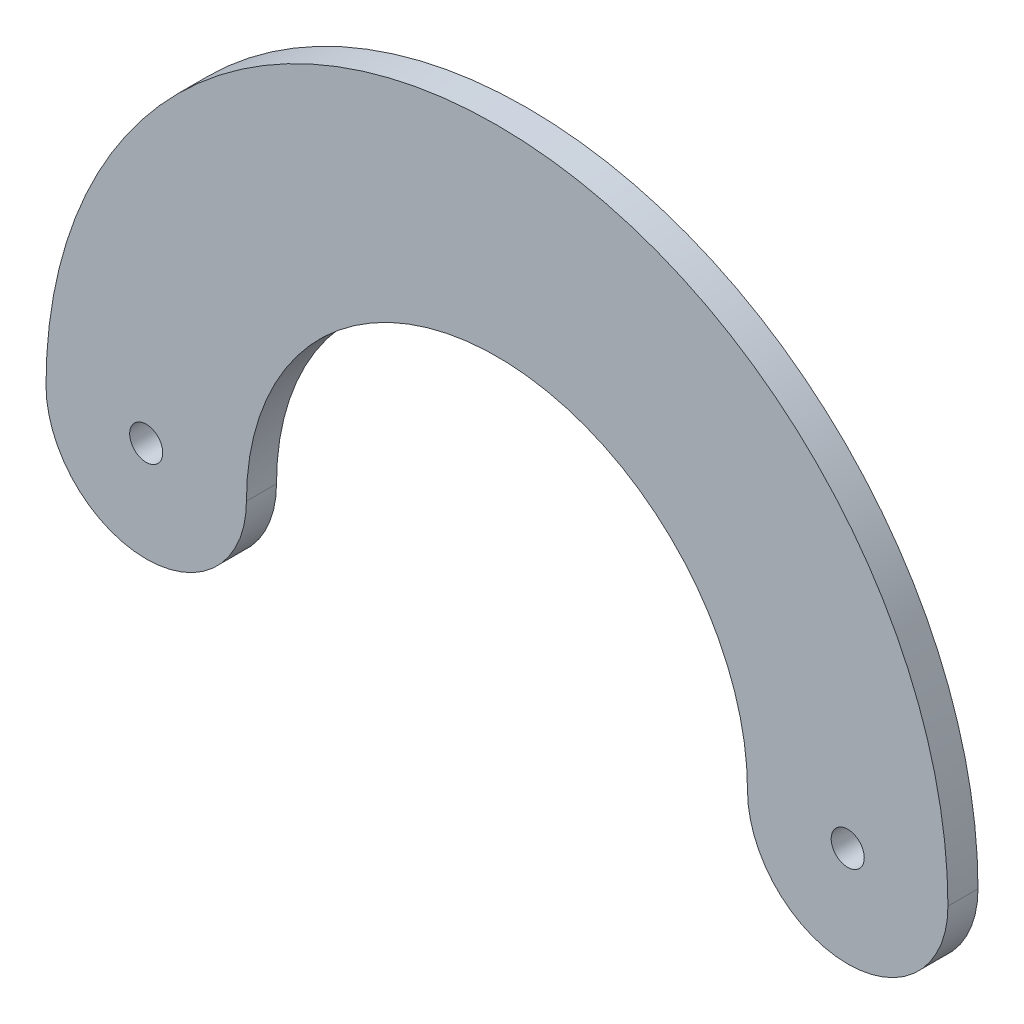
ISO-10303-21;
HEADER;
FILE_DESCRIPTION(('STEP AP214'),'2;1');
FILE_NAME('part.step','',(''),(''),'','','');
FILE_SCHEMA(('AUTOMOTIVE_DESIGN { 1 0 10303 214 1 1 1 1 }'));
ENDSEC;
DATA;
#1=APPLICATION_CONTEXT('core data for automotive mechanical design processes');
#2=APPLICATION_PROTOCOL_DEFINITION('international standard','automotive_design',2000,#1);
#3=PRODUCT_CONTEXT('',#1,'mechanical');
#4=PRODUCT('Part','Part','',(#3));
#5=PRODUCT_RELATED_PRODUCT_CATEGORY('part','',(#4));
#6=PRODUCT_DEFINITION_FORMATION('','',#4);
#7=PRODUCT_DEFINITION_CONTEXT('part definition',#1,'design');
#8=PRODUCT_DEFINITION('design','',#6,#7);
#9=PRODUCT_DEFINITION_SHAPE('','',#8);
#10=(LENGTH_UNIT() NAMED_UNIT(*) SI_UNIT(.MILLI.,.METRE.));
#11=(NAMED_UNIT(*) PLANE_ANGLE_UNIT() SI_UNIT($,.RADIAN.));
#12=(NAMED_UNIT(*) SI_UNIT($,.STERADIAN.) SOLID_ANGLE_UNIT());
#13=UNCERTAINTY_MEASURE_WITH_UNIT(LENGTH_MEASURE(1.E-05),#10,'distance_accuracy_value','');
#14=(GEOMETRIC_REPRESENTATION_CONTEXT(3) GLOBAL_UNCERTAINTY_ASSIGNED_CONTEXT((#13)) GLOBAL_UNIT_ASSIGNED_CONTEXT((#10,
#11,#12)) REPRESENTATION_CONTEXT('',''));
#15=CARTESIAN_POINT('',(0.,0.,0.));
#16=DIRECTION('',(0.,0.,1.));
#17=DIRECTION('',(1.,0.,0.));
#18=AXIS2_PLACEMENT_3D('',#15,#16,#17);
#19=CARTESIAN_POINT('',(0.,0.,3.));
#20=DIRECTION('',(0.,0.,-1.));
#21=DIRECTION('',(-1.,0.,0.));
#22=AXIS2_PLACEMENT_3D('',#19,#20,#21);
#23=CYLINDRICAL_SURFACE('',#22,25.);
#24=CARTESIAN_POINT('',(0.,0.,0.));
#25=DIRECTION('',(0.,0.,1.));
#26=DIRECTION('',(1.,0.,0.));
#27=AXIS2_PLACEMENT_3D('',#24,#25,#26);
#28=CIRCLE('',#27,25.);
#29=CARTESIAN_POINT('',(-25.,0.,0.));
#30=VERTEX_POINT('',#29);
#31=CARTESIAN_POINT('',(25.,0.,0.));
#32=VERTEX_POINT('',#31);
#33=EDGE_CURVE('E104',#30,#32,#28,.F.);
#34=ORIENTED_EDGE('',*,*,#33,.T.);
#35=DIRECTION('',(0.,0.,-1.));
#36=VECTOR('',#35,1.);
#37=CARTESIAN_POINT('',(25.,0.,3.));
#38=LINE('',#37,#36);
#39=CARTESIAN_POINT('',(25.,0.,3.));
#40=VERTEX_POINT('',#39);
#41=EDGE_CURVE('E11',#40,#32,#38,.T.);
#42=ORIENTED_EDGE('',*,*,#41,.F.);
#43=CARTESIAN_POINT('',(0.,0.,3.));
#44=DIRECTION('',(0.,0.,1.));
#45=DIRECTION('',(1.,0.,0.));
#46=AXIS2_PLACEMENT_3D('',#43,#44,#45);
#47=CIRCLE('',#46,25.);
#48=CARTESIAN_POINT('',(-25.,0.,3.));
#49=VERTEX_POINT('',#48);
#50=EDGE_CURVE('E84',#49,#40,#47,.F.);
#51=ORIENTED_EDGE('',*,*,#50,.F.);
#52=DIRECTION('',(0.,0.,-1.));
#53=VECTOR('',#52,1.);
#54=CARTESIAN_POINT('',(-25.,0.,3.));
#55=LINE('',#54,#53);
#56=EDGE_CURVE('E51',#49,#30,#55,.T.);
#57=ORIENTED_EDGE('',*,*,#56,.T.);
#58=EDGE_LOOP('',(#34,#42,#51,#57));
#59=FACE_BOUND('',#58,.T.);
#60=ADVANCED_FACE('F34',(#59),#23,.F.);
#61=CARTESIAN_POINT('',(35.,0.,3.));
#62=DIRECTION('',(0.,0.,-1.));
#63=DIRECTION('',(-1.,0.,0.));
#64=AXIS2_PLACEMENT_3D('',#61,#62,#63);
#65=CYLINDRICAL_SURFACE('',#64,10.);
#66=CARTESIAN_POINT('',(35.,0.,0.));
#67=DIRECTION('',(0.,0.,1.));
#68=DIRECTION('',(1.,0.,0.));
#69=AXIS2_PLACEMENT_3D('',#66,#67,#68);
#70=CIRCLE('',#69,10.);
#71=CARTESIAN_POINT('',(45.,0.,0.));
#72=VERTEX_POINT('',#71);
#73=EDGE_CURVE('E89',#32,#72,#70,.T.);
#74=ORIENTED_EDGE('',*,*,#73,.T.);
#75=DIRECTION('',(0.,0.,-1.));
#76=VECTOR('',#75,1.);
#77=CARTESIAN_POINT('',(45.,0.,3.));
#78=LINE('',#77,#76);
#79=CARTESIAN_POINT('',(45.,0.,3.));
#80=VERTEX_POINT('',#79);
#81=EDGE_CURVE('E43',#80,#72,#78,.T.);
#82=ORIENTED_EDGE('',*,*,#81,.F.);
#83=CARTESIAN_POINT('',(35.,0.,3.));
#84=DIRECTION('',(0.,0.,1.));
#85=DIRECTION('',(1.,0.,0.));
#86=AXIS2_PLACEMENT_3D('',#83,#84,#85);
#87=CIRCLE('',#86,10.);
#88=EDGE_CURVE('E76',#40,#80,#87,.T.);
#89=ORIENTED_EDGE('',*,*,#88,.F.);
#90=ORIENTED_EDGE('',*,*,#41,.T.);
#91=EDGE_LOOP('',(#74,#82,#89,#90));
#92=FACE_BOUND('',#91,.T.);
#93=ADVANCED_FACE('F88',(#92),#65,.T.);
#94=CARTESIAN_POINT('',(0.,0.,3.));
#95=DIRECTION('',(0.,0.,-1.));
#96=DIRECTION('',(-1.,0.,0.));
#97=AXIS2_PLACEMENT_3D('',#94,#95,#96);
#98=CYLINDRICAL_SURFACE('',#97,45.);
#99=CARTESIAN_POINT('',(0.,0.,0.));
#100=DIRECTION('',(0.,0.,1.));
#101=DIRECTION('',(1.,0.,0.));
#102=AXIS2_PLACEMENT_3D('',#99,#100,#101);
#103=CIRCLE('',#102,45.);
#104=CARTESIAN_POINT('',(-45.,0.,0.));
#105=VERTEX_POINT('',#104);
#106=EDGE_CURVE('E107',#105,#72,#103,.F.);
#107=ORIENTED_EDGE('',*,*,#106,.F.);
#108=DIRECTION('',(0.,0.,-1.));
#109=VECTOR('',#108,1.);
#110=CARTESIAN_POINT('',(-45.,0.,3.));
#111=LINE('',#110,#109);
#112=CARTESIAN_POINT('',(-45.,0.,3.));
#113=VERTEX_POINT('',#112);
#114=EDGE_CURVE('E65',#113,#105,#111,.T.);
#115=ORIENTED_EDGE('',*,*,#114,.F.);
#116=CARTESIAN_POINT('',(0.,0.,3.));
#117=DIRECTION('',(0.,0.,1.));
#118=DIRECTION('',(1.,0.,0.));
#119=AXIS2_PLACEMENT_3D('',#116,#117,#118);
#120=CIRCLE('',#119,45.);
#121=EDGE_CURVE('E83',#113,#80,#120,.F.);
#122=ORIENTED_EDGE('',*,*,#121,.T.);
#123=ORIENTED_EDGE('',*,*,#81,.T.);
#124=EDGE_LOOP('',(#107,#115,#122,#123));
#125=FACE_BOUND('',#124,.T.);
#126=ADVANCED_FACE('F92',(#125),#98,.T.);
#127=CARTESIAN_POINT('',(-35.,0.,3.));
#128=DIRECTION('',(0.,0.,-1.));
#129=DIRECTION('',(-1.,0.,0.));
#130=AXIS2_PLACEMENT_3D('',#127,#128,#129);
#131=CYLINDRICAL_SURFACE('',#130,1.65);
#132=CARTESIAN_POINT('',(-35.,0.,3.));
#133=DIRECTION('',(0.,0.,1.));
#134=DIRECTION('',(1.,0.,0.));
#135=AXIS2_PLACEMENT_3D('',#132,#133,#134);
#136=CIRCLE('',#135,1.65);
#137=CARTESIAN_POINT('',(-33.35,0.,3.));
#138=VERTEX_POINT('',#137);
#139=EDGE_CURVE('E116',#138,#138,#136,.T.);
#140=ORIENTED_EDGE('',*,*,#139,.T.);
#141=EDGE_LOOP('',(#140));
#142=FACE_BOUND('',#141,.T.);
#143=CARTESIAN_POINT('',(-35.,0.,0.));
#144=DIRECTION('',(0.,0.,1.));
#145=DIRECTION('',(1.,0.,0.));
#146=AXIS2_PLACEMENT_3D('',#143,#144,#145);
#147=CIRCLE('',#146,1.65);
#148=CARTESIAN_POINT('',(-33.35,0.,0.));
#149=VERTEX_POINT('',#148);
#150=EDGE_CURVE('E101',#149,#149,#147,.T.);
#151=ORIENTED_EDGE('',*,*,#150,.F.);
#152=EDGE_LOOP('',(#151));
#153=FACE_BOUND('',#152,.T.);
#154=ADVANCED_FACE('F124',(#142,#153),#131,.F.);
#155=CARTESIAN_POINT('',(35.,0.,3.));
#156=DIRECTION('',(0.,0.,-1.));
#157=DIRECTION('',(-1.,0.,0.));
#158=AXIS2_PLACEMENT_3D('',#155,#156,#157);
#159=CYLINDRICAL_SURFACE('',#158,1.65);
#160=CARTESIAN_POINT('',(35.,0.,3.));
#161=DIRECTION('',(0.,0.,1.));
#162=DIRECTION('',(1.,0.,0.));
#163=AXIS2_PLACEMENT_3D('',#160,#161,#162);
#164=CIRCLE('',#163,1.65);
#165=CARTESIAN_POINT('',(36.65,0.,3.));
#166=VERTEX_POINT('',#165);
#167=EDGE_CURVE('E112',#166,#166,#164,.T.);
#168=ORIENTED_EDGE('',*,*,#167,.T.);
#169=EDGE_LOOP('',(#168));
#170=FACE_BOUND('',#169,.T.);
#171=CARTESIAN_POINT('',(35.,0.,0.));
#172=DIRECTION('',(0.,0.,1.));
#173=DIRECTION('',(1.,0.,0.));
#174=AXIS2_PLACEMENT_3D('',#171,#172,#173);
#175=CIRCLE('',#174,1.65);
#176=CARTESIAN_POINT('',(36.65,0.,0.));
#177=VERTEX_POINT('',#176);
#178=EDGE_CURVE('E98',#177,#177,#175,.T.);
#179=ORIENTED_EDGE('',*,*,#178,.F.);
#180=EDGE_LOOP('',(#179));
#181=FACE_BOUND('',#180,.T.);
#182=ADVANCED_FACE('F36',(#170,#181),#159,.F.);
#183=CARTESIAN_POINT('',(-35.,0.,3.));
#184=DIRECTION('',(0.,0.,-1.));
#185=DIRECTION('',(-1.,0.,0.));
#186=AXIS2_PLACEMENT_3D('',#183,#184,#185);
#187=CYLINDRICAL_SURFACE('',#186,10.);
#188=CARTESIAN_POINT('',(-35.,0.,0.));
#189=DIRECTION('',(0.,0.,1.));
#190=DIRECTION('',(1.,0.,0.));
#191=AXIS2_PLACEMENT_3D('',#188,#189,#190);
#192=CIRCLE('',#191,10.);
#193=EDGE_CURVE('E109',#30,#105,#192,.F.);
#194=ORIENTED_EDGE('',*,*,#193,.F.);
#195=ORIENTED_EDGE('',*,*,#56,.F.);
#196=CARTESIAN_POINT('',(-35.,0.,3.));
#197=DIRECTION('',(0.,0.,1.));
#198=DIRECTION('',(1.,0.,0.));
#199=AXIS2_PLACEMENT_3D('',#196,#197,#198);
#200=CIRCLE('',#199,10.);
#201=EDGE_CURVE('E93',#49,#113,#200,.F.);
#202=ORIENTED_EDGE('',*,*,#201,.T.);
#203=ORIENTED_EDGE('',*,*,#114,.T.);
#204=EDGE_LOOP('',(#194,#195,#202,#203));
#205=FACE_BOUND('',#204,.T.);
#206=ADVANCED_FACE('F129',(#205),#187,.T.);
#207=CARTESIAN_POINT('',(0.,0.,3.));
#208=DIRECTION('',(0.,0.,1.));
#209=DIRECTION('',(1.,0.,0.));
#210=AXIS2_PLACEMENT_3D('',#207,#208,#209);
#211=PLANE('',#210);
#212=ORIENTED_EDGE('',*,*,#167,.F.);
#213=EDGE_LOOP('',(#212));
#214=FACE_BOUND('',#213,.T.);
#215=ORIENTED_EDGE('',*,*,#139,.F.);
#216=EDGE_LOOP('',(#215));
#217=FACE_BOUND('',#216,.T.);
#218=ORIENTED_EDGE('',*,*,#50,.T.);
#219=ORIENTED_EDGE('',*,*,#88,.T.);
#220=ORIENTED_EDGE('',*,*,#121,.F.);
#221=ORIENTED_EDGE('',*,*,#201,.F.);
#222=EDGE_LOOP('',(#218,#219,#220,#221));
#223=FACE_BOUND('',#222,.T.);
#224=ADVANCED_FACE('F80',(#214,#217,#223),#211,.T.);
#225=CARTESIAN_POINT('',(0.,0.,0.));
#226=DIRECTION('',(0.,0.,1.));
#227=DIRECTION('',(1.,0.,0.));
#228=AXIS2_PLACEMENT_3D('',#225,#226,#227);
#229=PLANE('',#228);
#230=ORIENTED_EDGE('',*,*,#178,.T.);
#231=EDGE_LOOP('',(#230));
#232=FACE_BOUND('',#231,.T.);
#233=ORIENTED_EDGE('',*,*,#150,.T.);
#234=EDGE_LOOP('',(#233));
#235=FACE_BOUND('',#234,.T.);
#236=ORIENTED_EDGE('',*,*,#33,.F.);
#237=ORIENTED_EDGE('',*,*,#193,.T.);
#238=ORIENTED_EDGE('',*,*,#106,.T.);
#239=ORIENTED_EDGE('',*,*,#73,.F.);
#240=EDGE_LOOP('',(#236,#237,#238,#239));
#241=FACE_BOUND('',#240,.T.);
#242=ADVANCED_FACE('F128',(#232,#235,#241),#229,.F.);
#243=CLOSED_SHELL('',(#60,#93,#126,#154,#182,#206,#224,#242));
#244=MANIFOLD_SOLID_BREP('B2',#243);
#245=ADVANCED_BREP_SHAPE_REPRESENTATION('',(#18,#244),#14);
#246=SHAPE_DEFINITION_REPRESENTATION(#9,#245);
ENDSEC;
END-ISO-10303-21;
